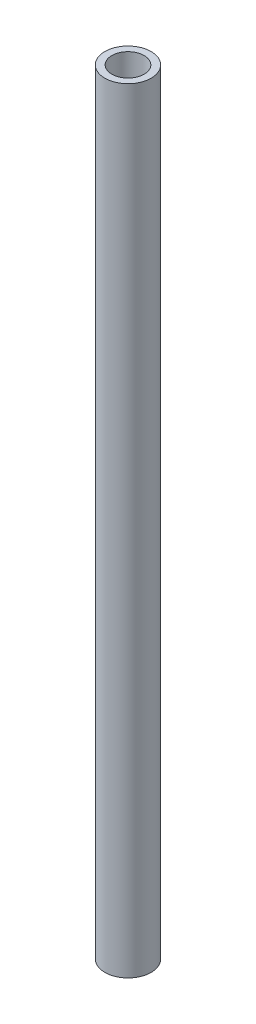
ISO-10303-21;
HEADER;
FILE_DESCRIPTION(('STEP AP214'),'2;1');
FILE_NAME('part.step','',(''),(''),'','','');
FILE_SCHEMA(('AUTOMOTIVE_DESIGN { 1 0 10303 214 1 1 1 1 }'));
ENDSEC;
DATA;
#1=APPLICATION_CONTEXT('core data for automotive mechanical design processes');
#2=APPLICATION_PROTOCOL_DEFINITION('international standard','automotive_design',2000,#1);
#3=PRODUCT_CONTEXT('',#1,'mechanical');
#4=PRODUCT('Part','Part','',(#3));
#5=PRODUCT_RELATED_PRODUCT_CATEGORY('part','',(#4));
#6=PRODUCT_DEFINITION_FORMATION('','',#4);
#7=PRODUCT_DEFINITION_CONTEXT('part definition',#1,'design');
#8=PRODUCT_DEFINITION('design','',#6,#7);
#9=PRODUCT_DEFINITION_SHAPE('','',#8);
#10=(LENGTH_UNIT() NAMED_UNIT(*) SI_UNIT(.MILLI.,.METRE.));
#11=(NAMED_UNIT(*) PLANE_ANGLE_UNIT() SI_UNIT($,.RADIAN.));
#12=(NAMED_UNIT(*) SI_UNIT($,.STERADIAN.) SOLID_ANGLE_UNIT());
#13=UNCERTAINTY_MEASURE_WITH_UNIT(LENGTH_MEASURE(1.E-05),#10,'distance_accuracy_value','');
#14=(GEOMETRIC_REPRESENTATION_CONTEXT(3) GLOBAL_UNCERTAINTY_ASSIGNED_CONTEXT((#13)) GLOBAL_UNIT_ASSIGNED_CONTEXT((#10,
#11,#12)) REPRESENTATION_CONTEXT('',''));
#15=CARTESIAN_POINT('',(0.,0.,0.));
#16=DIRECTION('',(0.,0.,1.));
#17=DIRECTION('',(1.,0.,0.));
#18=AXIS2_PLACEMENT_3D('',#15,#16,#17);
#19=CARTESIAN_POINT('',(138.296178343949,709.474522292994,0.));
#20=DIRECTION('',(0.,1.,0.));
#21=DIRECTION('',(-1.,0.,0.));
#22=AXIS2_PLACEMENT_3D('',#19,#20,#21);
#23=CYLINDRICAL_SURFACE('',#22,7.00000000000001);
#24=CARTESIAN_POINT('',(138.296178343949,41.608280254777,0.));
#25=DIRECTION('',(0.,1.,0.));
#26=DIRECTION('',(-1.,0.,0.));
#27=AXIS2_PLACEMENT_3D('',#24,#25,#26);
#28=CIRCLE('',#27,6.99999999999998);
#29=CARTESIAN_POINT('',(131.296178343949,41.608280254777,0.));
#30=VERTEX_POINT('',#29);
#31=EDGE_CURVE('E10',#30,#30,#28,.T.);
#32=ORIENTED_EDGE('',*,*,#31,.F.);
#33=EDGE_LOOP('',(#32));
#34=FACE_BOUND('',#33,.T.);
#35=CARTESIAN_POINT('',(138.296178343949,376.608280254777,0.));
#36=DIRECTION('',(0.,1.,0.));
#37=DIRECTION('',(-1.,0.,0.));
#38=AXIS2_PLACEMENT_3D('',#35,#36,#37);
#39=CIRCLE('',#38,7.00000000000002);
#40=CARTESIAN_POINT('',(131.296178343949,376.608280254777,0.));
#41=VERTEX_POINT('',#40);
#42=EDGE_CURVE('E46',#41,#41,#39,.T.);
#43=ORIENTED_EDGE('',*,*,#42,.T.);
#44=EDGE_LOOP('',(#43));
#45=FACE_BOUND('',#44,.T.);
#46=ADVANCED_FACE('F32',(#34,#45),#23,.F.);
#47=CARTESIAN_POINT('',(148.296178343949,41.608280254777,0.));
#48=DIRECTION('',(0.,-1.,0.));
#49=DIRECTION('',(1.,0.,0.));
#50=AXIS2_PLACEMENT_3D('',#47,#48,#49);
#51=PLANE('',#50);
#52=ORIENTED_EDGE('',*,*,#31,.T.);
#53=EDGE_LOOP('',(#52));
#54=FACE_BOUND('',#53,.T.);
#55=CARTESIAN_POINT('',(138.296178343949,41.608280254777,0.));
#56=DIRECTION('',(0.,1.,0.));
#57=DIRECTION('',(-1.,0.,0.));
#58=AXIS2_PLACEMENT_3D('',#55,#56,#57);
#59=CIRCLE('',#58,9.99999999999998);
#60=CARTESIAN_POINT('',(128.296178343949,41.608280254777,0.));
#61=VERTEX_POINT('',#60);
#62=EDGE_CURVE('E38',#61,#61,#59,.T.);
#63=ORIENTED_EDGE('',*,*,#62,.F.);
#64=EDGE_LOOP('',(#63));
#65=FACE_BOUND('',#64,.T.);
#66=ADVANCED_FACE('F61',(#54,#65),#51,.T.);
#67=CARTESIAN_POINT('',(138.296178343949,709.474522292994,0.));
#68=DIRECTION('',(0.,1.,0.));
#69=DIRECTION('',(-1.,0.,0.));
#70=AXIS2_PLACEMENT_3D('',#67,#68,#69);
#71=CYLINDRICAL_SURFACE('',#70,10.);
#72=ORIENTED_EDGE('',*,*,#62,.T.);
#73=EDGE_LOOP('',(#72));
#74=FACE_BOUND('',#73,.T.);
#75=CARTESIAN_POINT('',(138.296178343949,376.608280254777,0.));
#76=DIRECTION('',(0.,1.,0.));
#77=DIRECTION('',(-1.,0.,0.));
#78=AXIS2_PLACEMENT_3D('',#75,#76,#77);
#79=CIRCLE('',#78,10.);
#80=CARTESIAN_POINT('',(128.296178343949,376.608280254777,0.));
#81=VERTEX_POINT('',#80);
#82=EDGE_CURVE('E42',#81,#81,#79,.T.);
#83=ORIENTED_EDGE('',*,*,#82,.F.);
#84=EDGE_LOOP('',(#83));
#85=FACE_BOUND('',#84,.T.);
#86=ADVANCED_FACE('F55',(#74,#85),#71,.T.);
#87=CARTESIAN_POINT('',(145.296178343949,376.608280254777,0.));
#88=DIRECTION('',(0.,1.,0.));
#89=DIRECTION('',(-1.,0.,0.));
#90=AXIS2_PLACEMENT_3D('',#87,#88,#89);
#91=PLANE('',#90);
#92=ORIENTED_EDGE('',*,*,#82,.T.);
#93=EDGE_LOOP('',(#92));
#94=FACE_BOUND('',#93,.T.);
#95=ORIENTED_EDGE('',*,*,#42,.F.);
#96=EDGE_LOOP('',(#95));
#97=FACE_BOUND('',#96,.T.);
#98=ADVANCED_FACE('F53',(#94,#97),#91,.T.);
#99=CLOSED_SHELL('',(#46,#66,#86,#98));
#100=MANIFOLD_SOLID_BREP('B2',#99);
#101=ADVANCED_BREP_SHAPE_REPRESENTATION('',(#18,#100),#14);
#102=SHAPE_DEFINITION_REPRESENTATION(#9,#101);
ENDSEC;
END-ISO-10303-21;
